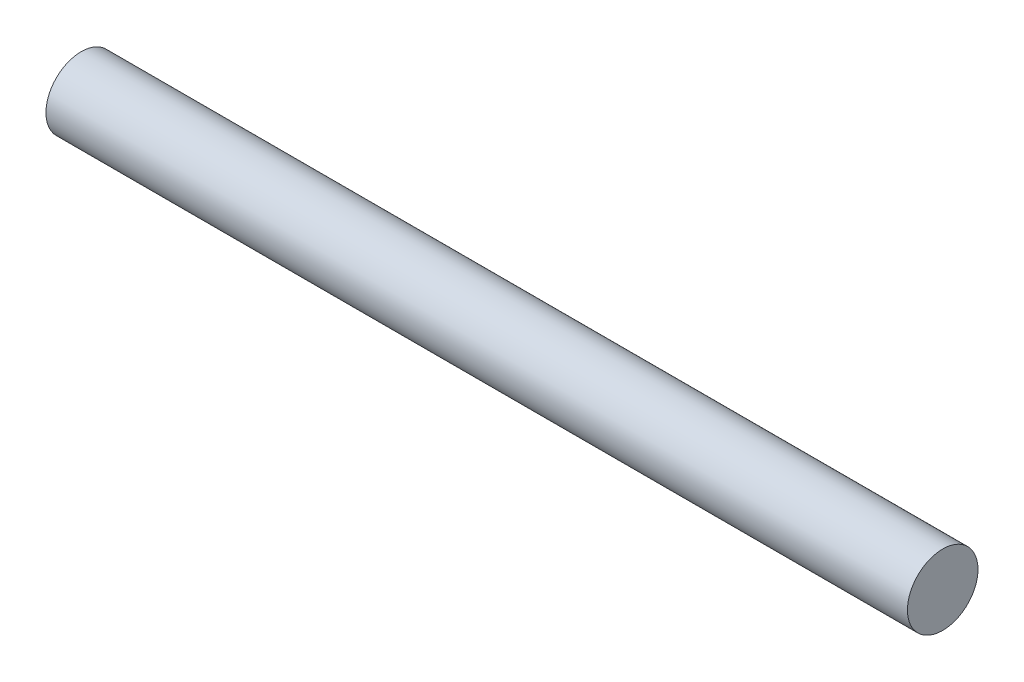
ISO-10303-21;
HEADER;
FILE_DESCRIPTION(('STEP AP214'),'2;1');
FILE_NAME('part.step','',(''),(''),'','','');
FILE_SCHEMA(('AUTOMOTIVE_DESIGN { 1 0 10303 214 1 1 1 1 }'));
ENDSEC;
DATA;
#1=APPLICATION_CONTEXT('core data for automotive mechanical design processes');
#2=APPLICATION_PROTOCOL_DEFINITION('international standard','automotive_design',2000,#1);
#3=PRODUCT_CONTEXT('',#1,'mechanical');
#4=PRODUCT('Part','Part','',(#3));
#5=PRODUCT_RELATED_PRODUCT_CATEGORY('part','',(#4));
#6=PRODUCT_DEFINITION_FORMATION('','',#4);
#7=PRODUCT_DEFINITION_CONTEXT('part definition',#1,'design');
#8=PRODUCT_DEFINITION('design','',#6,#7);
#9=PRODUCT_DEFINITION_SHAPE('','',#8);
#10=(LENGTH_UNIT() NAMED_UNIT(*) SI_UNIT(.MILLI.,.METRE.));
#11=(NAMED_UNIT(*) PLANE_ANGLE_UNIT() SI_UNIT($,.RADIAN.));
#12=(NAMED_UNIT(*) SI_UNIT($,.STERADIAN.) SOLID_ANGLE_UNIT());
#13=UNCERTAINTY_MEASURE_WITH_UNIT(LENGTH_MEASURE(1.E-05),#10,'distance_accuracy_value','');
#14=(GEOMETRIC_REPRESENTATION_CONTEXT(3) GLOBAL_UNCERTAINTY_ASSIGNED_CONTEXT((#13)) GLOBAL_UNIT_ASSIGNED_CONTEXT((#10,
#11,#12)) REPRESENTATION_CONTEXT('',''));
#15=CARTESIAN_POINT('',(0.,0.,0.));
#16=DIRECTION('',(0.,0.,1.));
#17=DIRECTION('',(1.,0.,0.));
#18=AXIS2_PLACEMENT_3D('',#15,#16,#17);
#19=CARTESIAN_POINT('',(260.35,0.,0.));
#20=DIRECTION('',(-1.,0.,0.));
#21=DIRECTION('',(0.,0.,1.));
#22=AXIS2_PLACEMENT_3D('',#19,#20,#21);
#23=CYLINDRICAL_SURFACE('',#22,10.668);
#24=CARTESIAN_POINT('',(260.35,0.,0.));
#25=DIRECTION('',(1.,0.,0.));
#26=DIRECTION('',(0.,0.,-1.));
#27=AXIS2_PLACEMENT_3D('',#24,#25,#26);
#28=CIRCLE('',#27,10.668);
#29=CARTESIAN_POINT('',(260.35,0.,-10.668));
#30=VERTEX_POINT('',#29);
#31=EDGE_CURVE('E10',#30,#30,#28,.T.);
#32=ORIENTED_EDGE('',*,*,#31,.F.);
#33=EDGE_LOOP('',(#32));
#34=FACE_BOUND('',#33,.T.);
#35=CARTESIAN_POINT('',(0.,0.,0.));
#36=DIRECTION('',(1.,0.,0.));
#37=DIRECTION('',(0.,0.,-1.));
#38=AXIS2_PLACEMENT_3D('',#35,#36,#37);
#39=CIRCLE('',#38,10.668);
#40=CARTESIAN_POINT('',(0.,0.,-10.668));
#41=VERTEX_POINT('',#40);
#42=EDGE_CURVE('E33',#41,#41,#39,.T.);
#43=ORIENTED_EDGE('',*,*,#42,.T.);
#44=EDGE_LOOP('',(#43));
#45=FACE_BOUND('',#44,.T.);
#46=ADVANCED_FACE('F30',(#34,#45),#23,.T.);
#47=CARTESIAN_POINT('',(260.35,0.,0.));
#48=DIRECTION('',(1.,0.,0.));
#49=DIRECTION('',(0.,0.,-1.));
#50=AXIS2_PLACEMENT_3D('',#47,#48,#49);
#51=PLANE('',#50);
#52=ORIENTED_EDGE('',*,*,#31,.T.);
#53=EDGE_LOOP('',(#52));
#54=FACE_BOUND('',#53,.T.);
#55=ADVANCED_FACE('F45',(#54),#51,.T.);
#56=CARTESIAN_POINT('',(0.,0.,0.));
#57=DIRECTION('',(1.,0.,0.));
#58=DIRECTION('',(0.,0.,-1.));
#59=AXIS2_PLACEMENT_3D('',#56,#57,#58);
#60=PLANE('',#59);
#61=ORIENTED_EDGE('',*,*,#42,.F.);
#62=EDGE_LOOP('',(#61));
#63=FACE_BOUND('',#62,.T.);
#64=ADVANCED_FACE('F43',(#63),#60,.F.);
#65=CLOSED_SHELL('',(#46,#55,#64));
#66=MANIFOLD_SOLID_BREP('B2',#65);
#67=ADVANCED_BREP_SHAPE_REPRESENTATION('',(#18,#66),#14);
#68=SHAPE_DEFINITION_REPRESENTATION(#9,#67);
ENDSEC;
END-ISO-10303-21;
